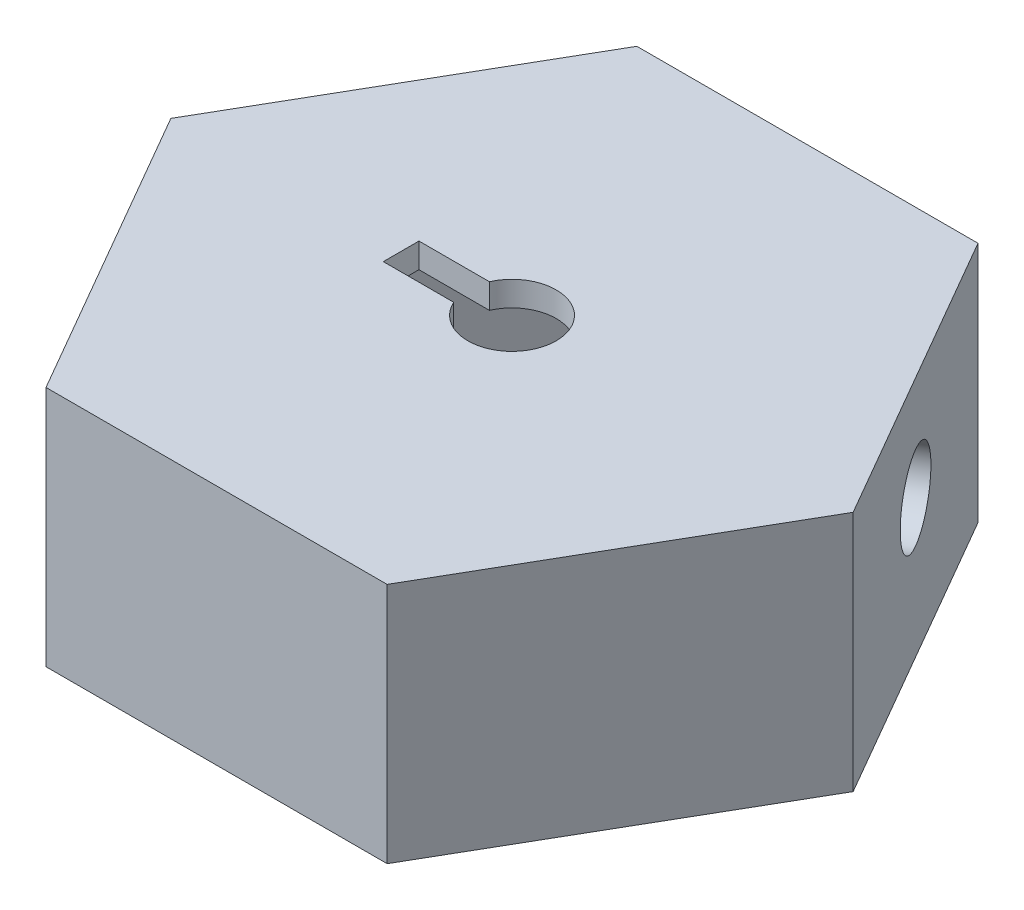
ISO-10303-21;
HEADER;
FILE_DESCRIPTION(('STEP AP214'),'2;1');
FILE_NAME('part.step','',(''),(''),'','','');
FILE_SCHEMA(('AUTOMOTIVE_DESIGN { 1 0 10303 214 1 1 1 1 }'));
ENDSEC;
DATA;
#1=APPLICATION_CONTEXT('core data for automotive mechanical design processes');
#2=APPLICATION_PROTOCOL_DEFINITION('international standard','automotive_design',2000,#1);
#3=PRODUCT_CONTEXT('',#1,'mechanical');
#4=PRODUCT('Part','Part','',(#3));
#5=PRODUCT_RELATED_PRODUCT_CATEGORY('part','',(#4));
#6=PRODUCT_DEFINITION_FORMATION('','',#4);
#7=PRODUCT_DEFINITION_CONTEXT('part definition',#1,'design');
#8=PRODUCT_DEFINITION('design','',#6,#7);
#9=PRODUCT_DEFINITION_SHAPE('','',#8);
#10=(LENGTH_UNIT() NAMED_UNIT(*) SI_UNIT(.MILLI.,.METRE.));
#11=(NAMED_UNIT(*) PLANE_ANGLE_UNIT() SI_UNIT($,.RADIAN.));
#12=(NAMED_UNIT(*) SI_UNIT($,.STERADIAN.) SOLID_ANGLE_UNIT());
#13=UNCERTAINTY_MEASURE_WITH_UNIT(LENGTH_MEASURE(1.E-05),#10,'distance_accuracy_value','');
#14=(GEOMETRIC_REPRESENTATION_CONTEXT(3) GLOBAL_UNCERTAINTY_ASSIGNED_CONTEXT((#13)) GLOBAL_UNIT_ASSIGNED_CONTEXT((#10,
#11,#12)) REPRESENTATION_CONTEXT('',''));
#15=CARTESIAN_POINT('',(0.,0.,0.));
#16=DIRECTION('',(0.,0.,1.));
#17=DIRECTION('',(1.,0.,0.));
#18=AXIS2_PLACEMENT_3D('',#15,#16,#17);
#19=CARTESIAN_POINT('',(0.,2.032,24.1967497817372));
#20=DIRECTION('',(0.,0.,-1.));
#21=DIRECTION('',(-1.,0.,0.));
#22=AXIS2_PLACEMENT_3D('',#19,#20,#21);
#23=PLANE('',#22);
#24=DIRECTION('',(0.,-1.,0.));
#25=VECTOR('',#24,1.);
#26=CARTESIAN_POINT('',(-13.97,2.032,24.1967497817372));
#27=LINE('',#26,#25);
#28=CARTESIAN_POINT('',(-13.97,2.032,24.1967497817372));
#29=VERTEX_POINT('',#28);
#30=CARTESIAN_POINT('',(-13.97,-17.78,24.1967497817372));
#31=VERTEX_POINT('',#30);
#32=EDGE_CURVE('E156',#29,#31,#27,.T.);
#33=ORIENTED_EDGE('',*,*,#32,.T.);
#34=DIRECTION('',(-1.,0.,0.));
#35=VECTOR('',#34,1.);
#36=CARTESIAN_POINT('',(13.97,-17.78,24.1967497817372));
#37=LINE('',#36,#35);
#38=CARTESIAN_POINT('',(13.97,-17.78,24.1967497817372));
#39=VERTEX_POINT('',#38);
#40=EDGE_CURVE('E220',#39,#31,#37,.T.);
#41=ORIENTED_EDGE('',*,*,#40,.F.);
#42=DIRECTION('',(0.,-1.,0.));
#43=VECTOR('',#42,1.);
#44=CARTESIAN_POINT('',(13.97,2.032,24.1967497817372));
#45=LINE('',#44,#43);
#46=CARTESIAN_POINT('',(13.97,2.032,24.1967497817372));
#47=VERTEX_POINT('',#46);
#48=EDGE_CURVE('E11',#47,#39,#45,.T.);
#49=ORIENTED_EDGE('',*,*,#48,.F.);
#50=DIRECTION('',(1.,0.,0.));
#51=VECTOR('',#50,1.);
#52=CARTESIAN_POINT('',(0.,2.032,24.1967497817372));
#53=LINE('',#52,#51);
#54=EDGE_CURVE('E186',#29,#47,#53,.T.);
#55=ORIENTED_EDGE('',*,*,#54,.F.);
#56=EDGE_LOOP('',(#33,#41,#49,#55));
#57=FACE_BOUND('',#56,.T.);
#58=ADVANCED_FACE('F37',(#57),#23,.F.);
#59=CARTESIAN_POINT('',(20.955,2.032,12.0983748908686));
#60=DIRECTION('',(-0.866025403784439,0.,-0.5));
#61=DIRECTION('',(-0.5,0.,0.866025403784439));
#62=AXIS2_PLACEMENT_3D('',#59,#60,#61);
#63=PLANE('',#62);
#64=ORIENTED_EDGE('',*,*,#48,.T.);
#65=DIRECTION('',(-0.5,0.,0.866025403784439));
#66=VECTOR('',#65,1.);
#67=CARTESIAN_POINT('',(27.94,-17.78,0.));
#68=LINE('',#67,#66);
#69=CARTESIAN_POINT('',(27.94,-17.78,0.));
#70=VERTEX_POINT('',#69);
#71=EDGE_CURVE('E202',#70,#39,#68,.T.);
#72=ORIENTED_EDGE('',*,*,#71,.F.);
#73=DIRECTION('',(0.,-1.,0.));
#74=VECTOR('',#73,1.);
#75=CARTESIAN_POINT('',(27.94,2.032,0.));
#76=LINE('',#75,#74);
#77=CARTESIAN_POINT('',(27.94,2.032,0.));
#78=VERTEX_POINT('',#77);
#79=EDGE_CURVE('E46',#78,#70,#76,.T.);
#80=ORIENTED_EDGE('',*,*,#79,.F.);
#81=DIRECTION('',(0.5,0.,-0.866025403784439));
#82=VECTOR('',#81,1.);
#83=CARTESIAN_POINT('',(20.955,2.032,12.0983748908686));
#84=LINE('',#83,#82);
#85=EDGE_CURVE('E193',#47,#78,#84,.T.);
#86=ORIENTED_EDGE('',*,*,#85,.F.);
#87=EDGE_LOOP('',(#64,#72,#80,#86));
#88=FACE_BOUND('',#87,.T.);
#89=ADVANCED_FACE('F199',(#88),#63,.F.);
#90=CARTESIAN_POINT('',(20.955,2.032,-12.0983748908686));
#91=DIRECTION('',(-0.866025403784439,0.,0.5));
#92=DIRECTION('',(0.5,0.,0.866025403784439));
#93=AXIS2_PLACEMENT_3D('',#90,#91,#92);
#94=PLANE('',#93);
#95=CARTESIAN_POINT('',(20.955,-6.477,-12.0983748908686));
#96=DIRECTION('',(0.866025403784439,0.,-0.5));
#97=DIRECTION('',(-0.5,0.,-0.866025403784439));
#98=AXIS2_PLACEMENT_3D('',#95,#96,#97);
#99=CIRCLE('',#98,3.429);
#100=CARTESIAN_POINT('',(19.2405,-6.477,-15.0679760004454));
#101=VERTEX_POINT('',#100);
#102=EDGE_CURVE('E260',#101,#101,#99,.T.);
#103=ORIENTED_EDGE('',*,*,#102,.F.);
#104=EDGE_LOOP('',(#103));
#105=FACE_BOUND('',#104,.T.);
#106=ORIENTED_EDGE('',*,*,#79,.T.);
#107=DIRECTION('',(0.5,0.,0.866025403784439));
#108=VECTOR('',#107,1.);
#109=CARTESIAN_POINT('',(13.97,-17.78,-24.1967497817372));
#110=LINE('',#109,#108);
#111=CARTESIAN_POINT('',(13.97,-17.78,-24.1967497817372));
#112=VERTEX_POINT('',#111);
#113=EDGE_CURVE('E147',#112,#70,#110,.T.);
#114=ORIENTED_EDGE('',*,*,#113,.F.);
#115=DIRECTION('',(0.,-1.,0.));
#116=VECTOR('',#115,1.);
#117=CARTESIAN_POINT('',(13.97,2.032,-24.1967497817372));
#118=LINE('',#117,#116);
#119=CARTESIAN_POINT('',(13.97,2.032,-24.1967497817372));
#120=VERTEX_POINT('',#119);
#121=EDGE_CURVE('E134',#120,#112,#118,.T.);
#122=ORIENTED_EDGE('',*,*,#121,.F.);
#123=DIRECTION('',(-0.5,0.,-0.866025403784439));
#124=VECTOR('',#123,1.);
#125=CARTESIAN_POINT('',(20.955,2.032,-12.0983748908686));
#126=LINE('',#125,#124);
#127=EDGE_CURVE('E119',#78,#120,#126,.T.);
#128=ORIENTED_EDGE('',*,*,#127,.F.);
#129=EDGE_LOOP('',(#106,#114,#122,#128));
#130=FACE_BOUND('',#129,.T.);
#131=ADVANCED_FACE('F206',(#105,#130),#94,.F.);
#132=CARTESIAN_POINT('',(0.,2.032,-24.1967497817372));
#133=DIRECTION('',(0.,0.,1.));
#134=DIRECTION('',(1.,0.,0.));
#135=AXIS2_PLACEMENT_3D('',#132,#133,#134);
#136=PLANE('',#135);
#137=CARTESIAN_POINT('',(0.,-6.477,-24.1967497817372));
#138=DIRECTION('',(0.,0.,-1.));
#139=DIRECTION('',(-1.,0.,0.));
#140=AXIS2_PLACEMENT_3D('',#137,#138,#139);
#141=CIRCLE('',#140,3.429);
#142=CARTESIAN_POINT('',(-3.42900000000005,-6.477,-24.1967497817372));
#143=VERTEX_POINT('',#142);
#144=EDGE_CURVE('E279',#143,#143,#141,.T.);
#145=ORIENTED_EDGE('',*,*,#144,.F.);
#146=EDGE_LOOP('',(#145));
#147=FACE_BOUND('',#146,.T.);
#148=ORIENTED_EDGE('',*,*,#121,.T.);
#149=DIRECTION('',(1.,0.,0.));
#150=VECTOR('',#149,1.);
#151=CARTESIAN_POINT('',(-13.97,-17.78,-24.1967497817372));
#152=LINE('',#151,#150);
#153=CARTESIAN_POINT('',(-13.97,-17.78,-24.1967497817372));
#154=VERTEX_POINT('',#153);
#155=EDGE_CURVE('E130',#154,#112,#152,.T.);
#156=ORIENTED_EDGE('',*,*,#155,.F.);
#157=DIRECTION('',(0.,-1.,0.));
#158=VECTOR('',#157,1.);
#159=CARTESIAN_POINT('',(-13.97,2.032,-24.1967497817372));
#160=LINE('',#159,#158);
#161=CARTESIAN_POINT('',(-13.97,2.032,-24.1967497817372));
#162=VERTEX_POINT('',#161);
#163=EDGE_CURVE('E126',#162,#154,#160,.T.);
#164=ORIENTED_EDGE('',*,*,#163,.F.);
#165=DIRECTION('',(-1.,0.,0.));
#166=VECTOR('',#165,1.);
#167=CARTESIAN_POINT('',(0.,2.032,-24.1967497817372));
#168=LINE('',#167,#166);
#169=EDGE_CURVE('E112',#120,#162,#168,.T.);
#170=ORIENTED_EDGE('',*,*,#169,.F.);
#171=EDGE_LOOP('',(#148,#156,#164,#170));
#172=FACE_BOUND('',#171,.T.);
#173=ADVANCED_FACE('F127',(#147,#172),#136,.F.);
#174=CARTESIAN_POINT('',(-20.955,2.032,-12.0983748908686));
#175=DIRECTION('',(0.866025403784439,0.,0.5));
#176=DIRECTION('',(0.5,0.,-0.866025403784439));
#177=AXIS2_PLACEMENT_3D('',#174,#175,#176);
#178=PLANE('',#177);
#179=CARTESIAN_POINT('',(-20.9550000000001,-6.477,-12.0983748908685));
#180=DIRECTION('',(-0.866025403784441,0.,-0.499999999999996));
#181=DIRECTION('',(-0.499999999999996,0.,0.866025403784441));
#182=AXIS2_PLACEMENT_3D('',#179,#180,#181);
#183=CIRCLE('',#182,3.429);
#184=CARTESIAN_POINT('',(-22.6695,-6.477,-9.12877378129167));
#185=VERTEX_POINT('',#184);
#186=EDGE_CURVE('E285',#185,#185,#183,.T.);
#187=ORIENTED_EDGE('',*,*,#186,.F.);
#188=EDGE_LOOP('',(#187));
#189=FACE_BOUND('',#188,.T.);
#190=ORIENTED_EDGE('',*,*,#163,.T.);
#191=DIRECTION('',(0.5,0.,-0.866025403784439));
#192=VECTOR('',#191,1.);
#193=CARTESIAN_POINT('',(-27.94,-17.78,0.));
#194=LINE('',#193,#192);
#195=CARTESIAN_POINT('',(-27.94,-17.78,0.));
#196=VERTEX_POINT('',#195);
#197=EDGE_CURVE('E213',#196,#154,#194,.T.);
#198=ORIENTED_EDGE('',*,*,#197,.F.);
#199=DIRECTION('',(0.,-1.,0.));
#200=VECTOR('',#199,1.);
#201=CARTESIAN_POINT('',(-27.94,2.032,0.));
#202=LINE('',#201,#200);
#203=CARTESIAN_POINT('',(-27.94,2.032,0.));
#204=VERTEX_POINT('',#203);
#205=EDGE_CURVE('E135',#204,#196,#202,.T.);
#206=ORIENTED_EDGE('',*,*,#205,.F.);
#207=DIRECTION('',(-0.5,0.,0.866025403784439));
#208=VECTOR('',#207,1.);
#209=CARTESIAN_POINT('',(-20.955,2.032,-12.0983748908686));
#210=LINE('',#209,#208);
#211=EDGE_CURVE('E116',#162,#204,#210,.T.);
#212=ORIENTED_EDGE('',*,*,#211,.F.);
#213=EDGE_LOOP('',(#190,#198,#206,#212));
#214=FACE_BOUND('',#213,.T.);
#215=ADVANCED_FACE('F137',(#189,#214),#178,.F.);
#216=CARTESIAN_POINT('',(0.,2.032,0.));
#217=DIRECTION('',(0.,-1.,0.));
#218=DIRECTION('',(0.,0.,-1.));
#219=AXIS2_PLACEMENT_3D('',#216,#217,#218);
#220=CYLINDRICAL_SURFACE('',#219,3.6195);
#221=CARTESIAN_POINT('',(0.,0.,0.));
#222=DIRECTION('',(0.,1.,0.));
#223=DIRECTION('',(0.,0.,1.));
#224=AXIS2_PLACEMENT_3D('',#221,#222,#223);
#225=CIRCLE('',#224,3.6195);
#226=CARTESIAN_POINT('',(-3.31175482184294,0.,1.4605));
#227=VERTEX_POINT('',#226);
#228=CARTESIAN_POINT('',(-3.31175482184294,0.,-1.4605));
#229=VERTEX_POINT('',#228);
#230=EDGE_CURVE('E143',#227,#229,#225,.T.);
#231=ORIENTED_EDGE('',*,*,#230,.F.);
#232=DIRECTION('',(0.,-1.,0.));
#233=VECTOR('',#232,1.);
#234=CARTESIAN_POINT('',(-3.31175482184294,2.032,1.4605));
#235=LINE('',#234,#233);
#236=CARTESIAN_POINT('',(-3.31175482184294,2.032,1.4605));
#237=VERTEX_POINT('',#236);
#238=EDGE_CURVE('E41',#237,#227,#235,.T.);
#239=ORIENTED_EDGE('',*,*,#238,.F.);
#240=CARTESIAN_POINT('',(0.,2.032,0.));
#241=DIRECTION('',(0.,1.,0.));
#242=DIRECTION('',(0.,0.,1.));
#243=AXIS2_PLACEMENT_3D('',#240,#241,#242);
#244=CIRCLE('',#243,3.6195);
#245=CARTESIAN_POINT('',(-3.31175482184294,2.032,-1.4605));
#246=VERTEX_POINT('',#245);
#247=EDGE_CURVE('E155',#237,#246,#244,.T.);
#248=ORIENTED_EDGE('',*,*,#247,.T.);
#249=DIRECTION('',(0.,-1.,0.));
#250=VECTOR('',#249,1.);
#251=CARTESIAN_POINT('',(-3.31175482184294,2.032,-1.4605));
#252=LINE('',#251,#250);
#253=EDGE_CURVE('E85',#246,#229,#252,.T.);
#254=ORIENTED_EDGE('',*,*,#253,.T.);
#255=EDGE_LOOP('',(#231,#239,#248,#254));
#256=FACE_BOUND('',#255,.T.);
#257=ADVANCED_FACE('F39',(#256),#220,.F.);
#258=CARTESIAN_POINT('',(0.,2.032,1.4605));
#259=DIRECTION('',(0.,0.,-1.));
#260=DIRECTION('',(-1.,0.,0.));
#261=AXIS2_PLACEMENT_3D('',#258,#259,#260);
#262=PLANE('',#261);
#263=DIRECTION('',(1.,0.,0.));
#264=VECTOR('',#263,1.);
#265=CARTESIAN_POINT('',(0.,0.,1.4605));
#266=LINE('',#265,#264);
#267=CARTESIAN_POINT('',(-9.0805,0.,1.4605));
#268=VERTEX_POINT('',#267);
#269=EDGE_CURVE('E146',#268,#227,#266,.T.);
#270=ORIENTED_EDGE('',*,*,#269,.F.);
#271=DIRECTION('',(0.,-1.,0.));
#272=VECTOR('',#271,1.);
#273=CARTESIAN_POINT('',(-9.0805,2.032,1.4605));
#274=LINE('',#273,#272);
#275=CARTESIAN_POINT('',(-9.0805,2.032,1.4605));
#276=VERTEX_POINT('',#275);
#277=EDGE_CURVE('E165',#276,#268,#274,.T.);
#278=ORIENTED_EDGE('',*,*,#277,.F.);
#279=DIRECTION('',(1.,0.,0.));
#280=VECTOR('',#279,1.);
#281=CARTESIAN_POINT('',(0.,2.032,1.4605));
#282=LINE('',#281,#280);
#283=EDGE_CURVE('E174',#276,#237,#282,.T.);
#284=ORIENTED_EDGE('',*,*,#283,.T.);
#285=ORIENTED_EDGE('',*,*,#238,.T.);
#286=EDGE_LOOP('',(#270,#278,#284,#285));
#287=FACE_BOUND('',#286,.T.);
#288=ADVANCED_FACE('F172',(#287),#262,.T.);
#289=CARTESIAN_POINT('',(-9.0805,2.032,0.));
#290=DIRECTION('',(1.,0.,0.));
#291=DIRECTION('',(0.,0.,-1.));
#292=AXIS2_PLACEMENT_3D('',#289,#290,#291);
#293=PLANE('',#292);
#294=DIRECTION('',(0.,0.,1.));
#295=VECTOR('',#294,1.);
#296=CARTESIAN_POINT('',(-9.0805,0.,0.));
#297=LINE('',#296,#295);
#298=CARTESIAN_POINT('',(-9.0805,0.,-1.4605));
#299=VERTEX_POINT('',#298);
#300=EDGE_CURVE('E150',#299,#268,#297,.T.);
#301=ORIENTED_EDGE('',*,*,#300,.F.);
#302=DIRECTION('',(0.,-1.,0.));
#303=VECTOR('',#302,1.);
#304=CARTESIAN_POINT('',(-9.0805,2.032,-1.4605));
#305=LINE('',#304,#303);
#306=CARTESIAN_POINT('',(-9.0805,2.032,-1.4605));
#307=VERTEX_POINT('',#306);
#308=EDGE_CURVE('E164',#307,#299,#305,.T.);
#309=ORIENTED_EDGE('',*,*,#308,.F.);
#310=DIRECTION('',(0.,0.,1.));
#311=VECTOR('',#310,1.);
#312=CARTESIAN_POINT('',(-9.0805,2.032,0.));
#313=LINE('',#312,#311);
#314=EDGE_CURVE('E181',#307,#276,#313,.T.);
#315=ORIENTED_EDGE('',*,*,#314,.T.);
#316=ORIENTED_EDGE('',*,*,#277,.T.);
#317=EDGE_LOOP('',(#301,#309,#315,#316));
#318=FACE_BOUND('',#317,.T.);
#319=ADVANCED_FACE('F178',(#318),#293,.T.);
#320=CARTESIAN_POINT('',(0.,2.032,-1.4605));
#321=DIRECTION('',(0.,0.,-1.));
#322=DIRECTION('',(-1.,0.,0.));
#323=AXIS2_PLACEMENT_3D('',#320,#321,#322);
#324=PLANE('',#323);
#325=DIRECTION('',(1.,0.,0.));
#326=VECTOR('',#325,1.);
#327=CARTESIAN_POINT('',(0.,0.,-1.4605));
#328=LINE('',#327,#326);
#329=EDGE_CURVE('E153',#299,#229,#328,.T.);
#330=ORIENTED_EDGE('',*,*,#329,.T.);
#331=ORIENTED_EDGE('',*,*,#253,.F.);
#332=DIRECTION('',(1.,0.,0.));
#333=VECTOR('',#332,1.);
#334=CARTESIAN_POINT('',(0.,2.032,-1.4605));
#335=LINE('',#334,#333);
#336=EDGE_CURVE('E183',#307,#246,#335,.T.);
#337=ORIENTED_EDGE('',*,*,#336,.F.);
#338=ORIENTED_EDGE('',*,*,#308,.T.);
#339=EDGE_LOOP('',(#330,#331,#337,#338));
#340=FACE_BOUND('',#339,.T.);
#341=ADVANCED_FACE('F184',(#340),#324,.F.);
#342=CARTESIAN_POINT('',(-20.955,2.032,12.0983748908686));
#343=DIRECTION('',(0.866025403784439,0.,-0.5));
#344=DIRECTION('',(-0.5,0.,-0.866025403784439));
#345=AXIS2_PLACEMENT_3D('',#342,#343,#344);
#346=PLANE('',#345);
#347=ORIENTED_EDGE('',*,*,#205,.T.);
#348=DIRECTION('',(-0.5,0.,-0.866025403784438));
#349=VECTOR('',#348,1.);
#350=CARTESIAN_POINT('',(-13.97,-17.78,24.1967497817372));
#351=LINE('',#350,#349);
#352=EDGE_CURVE('E216',#31,#196,#351,.T.);
#353=ORIENTED_EDGE('',*,*,#352,.F.);
#354=ORIENTED_EDGE('',*,*,#32,.F.);
#355=DIRECTION('',(0.5,0.,0.866025403784439));
#356=VECTOR('',#355,1.);
#357=CARTESIAN_POINT('',(-20.955,2.032,12.0983748908686));
#358=LINE('',#357,#356);
#359=EDGE_CURVE('E63',#204,#29,#358,.T.);
#360=ORIENTED_EDGE('',*,*,#359,.F.);
#361=EDGE_LOOP('',(#347,#353,#354,#360));
#362=FACE_BOUND('',#361,.T.);
#363=ADVANCED_FACE('F316',(#362),#346,.F.);
#364=CARTESIAN_POINT('',(0.,2.032,0.));
#365=DIRECTION('',(0.,1.,0.));
#366=DIRECTION('',(0.,0.,1.));
#367=AXIS2_PLACEMENT_3D('',#364,#365,#366);
#368=PLANE('',#367);
#369=ORIENTED_EDGE('',*,*,#247,.F.);
#370=ORIENTED_EDGE('',*,*,#283,.F.);
#371=ORIENTED_EDGE('',*,*,#314,.F.);
#372=ORIENTED_EDGE('',*,*,#336,.T.);
#373=EDGE_LOOP('',(#369,#370,#371,#372));
#374=FACE_BOUND('',#373,.T.);
#375=ORIENTED_EDGE('',*,*,#54,.T.);
#376=ORIENTED_EDGE('',*,*,#85,.T.);
#377=ORIENTED_EDGE('',*,*,#127,.T.);
#378=ORIENTED_EDGE('',*,*,#169,.T.);
#379=ORIENTED_EDGE('',*,*,#211,.T.);
#380=ORIENTED_EDGE('',*,*,#359,.T.);
#381=EDGE_LOOP('',(#375,#376,#377,#378,#379,#380));
#382=FACE_BOUND('',#381,.T.);
#383=ADVANCED_FACE('F114',(#374,#382),#368,.T.);
#384=CARTESIAN_POINT('',(0.,0.,0.));
#385=DIRECTION('',(0.,1.,0.));
#386=DIRECTION('',(0.,0.,1.));
#387=AXIS2_PLACEMENT_3D('',#384,#385,#386);
#388=PLANE('',#387);
#389=DIRECTION('',(0.5,0.,0.866025403784439));
#390=VECTOR('',#389,1.);
#391=CARTESIAN_POINT('',(12.7968242530067,0.,-22.1647497817372));
#392=LINE('',#391,#390);
#393=CARTESIAN_POINT('',(12.7968242530067,0.,-22.1647497817372));
#394=VERTEX_POINT('',#393);
#395=CARTESIAN_POINT('',(25.5936485060134,0.,0.));
#396=VERTEX_POINT('',#395);
#397=EDGE_CURVE('E241',#394,#396,#392,.T.);
#398=ORIENTED_EDGE('',*,*,#397,.T.);
#399=DIRECTION('',(-0.5,0.,0.866025403784439));
#400=VECTOR('',#399,1.);
#401=CARTESIAN_POINT('',(25.5936485060134,0.,0.));
#402=LINE('',#401,#400);
#403=CARTESIAN_POINT('',(12.7968242530067,0.,22.1647497817372));
#404=VERTEX_POINT('',#403);
#405=EDGE_CURVE('E257',#396,#404,#402,.T.);
#406=ORIENTED_EDGE('',*,*,#405,.T.);
#407=DIRECTION('',(-1.,0.,0.));
#408=VECTOR('',#407,1.);
#409=CARTESIAN_POINT('',(12.7968242530067,0.,22.1647497817372));
#410=LINE('',#409,#408);
#411=CARTESIAN_POINT('',(-12.7968242530067,0.,22.1647497817372));
#412=VERTEX_POINT('',#411);
#413=EDGE_CURVE('E254',#404,#412,#410,.T.);
#414=ORIENTED_EDGE('',*,*,#413,.T.);
#415=DIRECTION('',(-0.5,0.,-0.866025403784439));
#416=VECTOR('',#415,1.);
#417=CARTESIAN_POINT('',(-12.7968242530067,0.,22.1647497817372));
#418=LINE('',#417,#416);
#419=CARTESIAN_POINT('',(-25.5936485060134,0.,0.));
#420=VERTEX_POINT('',#419);
#421=EDGE_CURVE('E251',#412,#420,#418,.T.);
#422=ORIENTED_EDGE('',*,*,#421,.T.);
#423=DIRECTION('',(0.5,0.,-0.866025403784438));
#424=VECTOR('',#423,1.);
#425=CARTESIAN_POINT('',(-25.5936485060134,0.,0.));
#426=LINE('',#425,#424);
#427=CARTESIAN_POINT('',(-12.7968242530067,0.,-22.1647497817372));
#428=VERTEX_POINT('',#427);
#429=EDGE_CURVE('E248',#420,#428,#426,.T.);
#430=ORIENTED_EDGE('',*,*,#429,.T.);
#431=DIRECTION('',(1.,0.,0.));
#432=VECTOR('',#431,1.);
#433=CARTESIAN_POINT('',(-12.7968242530067,0.,-22.1647497817372));
#434=LINE('',#433,#432);
#435=EDGE_CURVE('E245',#428,#394,#434,.T.);
#436=ORIENTED_EDGE('',*,*,#435,.T.);
#437=EDGE_LOOP('',(#398,#406,#414,#422,#430,#436));
#438=FACE_BOUND('',#437,.T.);
#439=ORIENTED_EDGE('',*,*,#230,.T.);
#440=ORIENTED_EDGE('',*,*,#329,.F.);
#441=ORIENTED_EDGE('',*,*,#300,.T.);
#442=ORIENTED_EDGE('',*,*,#269,.T.);
#443=EDGE_LOOP('',(#439,#440,#441,#442));
#444=FACE_BOUND('',#443,.T.);
#445=ADVANCED_FACE('F177',(#438,#444),#388,.F.);
#446=CARTESIAN_POINT('',(0.,-17.78,0.));
#447=DIRECTION('',(0.,-1.,0.));
#448=DIRECTION('',(0.,0.,-1.));
#449=AXIS2_PLACEMENT_3D('',#446,#447,#448);
#450=PLANE('',#449);
#451=ORIENTED_EDGE('',*,*,#71,.T.);
#452=ORIENTED_EDGE('',*,*,#40,.T.);
#453=ORIENTED_EDGE('',*,*,#352,.T.);
#454=ORIENTED_EDGE('',*,*,#197,.T.);
#455=ORIENTED_EDGE('',*,*,#155,.T.);
#456=ORIENTED_EDGE('',*,*,#113,.T.);
#457=EDGE_LOOP('',(#451,#452,#453,#454,#455,#456));
#458=FACE_BOUND('',#457,.T.);
#459=DIRECTION('',(-1.,0.,0.));
#460=VECTOR('',#459,1.);
#461=CARTESIAN_POINT('',(12.7968242530067,-17.78,22.1647497817372));
#462=LINE('',#461,#460);
#463=CARTESIAN_POINT('',(12.7968242530067,-17.78,22.1647497817372));
#464=VERTEX_POINT('',#463);
#465=CARTESIAN_POINT('',(-12.7968242530067,-17.78,22.1647497817372));
#466=VERTEX_POINT('',#465);
#467=EDGE_CURVE('E271',#464,#466,#462,.T.);
#468=ORIENTED_EDGE('',*,*,#467,.F.);
#469=DIRECTION('',(-0.5,0.,0.866025403784439));
#470=VECTOR('',#469,1.);
#471=CARTESIAN_POINT('',(25.5936485060134,-17.78,0.));
#472=LINE('',#471,#470);
#473=CARTESIAN_POINT('',(25.5936485060134,-17.78,0.));
#474=VERTEX_POINT('',#473);
#475=EDGE_CURVE('E244',#474,#464,#472,.T.);
#476=ORIENTED_EDGE('',*,*,#475,.F.);
#477=DIRECTION('',(0.5,0.,0.866025403784439));
#478=VECTOR('',#477,1.);
#479=CARTESIAN_POINT('',(12.7968242530067,-17.78,-22.1647497817372));
#480=LINE('',#479,#478);
#481=CARTESIAN_POINT('',(12.7968242530067,-17.78,-22.1647497817372));
#482=VERTEX_POINT('',#481);
#483=EDGE_CURVE('E240',#482,#474,#480,.T.);
#484=ORIENTED_EDGE('',*,*,#483,.F.);
#485=DIRECTION('',(1.,0.,0.));
#486=VECTOR('',#485,1.);
#487=CARTESIAN_POINT('',(-12.7968242530067,-17.78,-22.1647497817372));
#488=LINE('',#487,#486);
#489=CARTESIAN_POINT('',(-12.7968242530067,-17.78,-22.1647497817372));
#490=VERTEX_POINT('',#489);
#491=EDGE_CURVE('E262',#490,#482,#488,.T.);
#492=ORIENTED_EDGE('',*,*,#491,.F.);
#493=DIRECTION('',(0.5,0.,-0.866025403784438));
#494=VECTOR('',#493,1.);
#495=CARTESIAN_POINT('',(-25.5936485060134,-17.78,0.));
#496=LINE('',#495,#494);
#497=CARTESIAN_POINT('',(-25.5936485060134,-17.78,0.));
#498=VERTEX_POINT('',#497);
#499=EDGE_CURVE('E265',#498,#490,#496,.T.);
#500=ORIENTED_EDGE('',*,*,#499,.F.);
#501=DIRECTION('',(-0.5,0.,-0.866025403784439));
#502=VECTOR('',#501,1.);
#503=CARTESIAN_POINT('',(-12.7968242530067,-17.78,22.1647497817372));
#504=LINE('',#503,#502);
#505=EDGE_CURVE('E268',#466,#498,#504,.T.);
#506=ORIENTED_EDGE('',*,*,#505,.F.);
#507=EDGE_LOOP('',(#468,#476,#484,#492,#500,#506));
#508=FACE_BOUND('',#507,.T.);
#509=ADVANCED_FACE('F210',(#458,#508),#450,.T.);
#510=CARTESIAN_POINT('',(25.5936485060134,-17.78,0.));
#511=DIRECTION('',(-0.866025403784438,0.,-0.5));
#512=DIRECTION('',(-0.5,0.,0.866025403784439));
#513=AXIS2_PLACEMENT_3D('',#510,#511,#512);
#514=PLANE('',#513);
#515=ORIENTED_EDGE('',*,*,#405,.F.);
#516=DIRECTION('',(0.,1.,0.));
#517=VECTOR('',#516,1.);
#518=CARTESIAN_POINT('',(25.5936485060134,-17.78,0.));
#519=LINE('',#518,#517);
#520=EDGE_CURVE('E54',#474,#396,#519,.T.);
#521=ORIENTED_EDGE('',*,*,#520,.F.);
#522=ORIENTED_EDGE('',*,*,#475,.T.);
#523=DIRECTION('',(0.,1.,0.));
#524=VECTOR('',#523,1.);
#525=CARTESIAN_POINT('',(12.7968242530067,-17.78,22.1647497817372));
#526=LINE('',#525,#524);
#527=EDGE_CURVE('E224',#464,#404,#526,.T.);
#528=ORIENTED_EDGE('',*,*,#527,.T.);
#529=EDGE_LOOP('',(#515,#521,#522,#528));
#530=FACE_BOUND('',#529,.T.);
#531=ADVANCED_FACE('F397',(#530),#514,.T.);
#532=CARTESIAN_POINT('',(12.7968242530067,-17.78,22.1647497817372));
#533=DIRECTION('',(0.,0.,-1.));
#534=DIRECTION('',(-1.,0.,0.));
#535=AXIS2_PLACEMENT_3D('',#532,#533,#534);
#536=PLANE('',#535);
#537=ORIENTED_EDGE('',*,*,#413,.F.);
#538=ORIENTED_EDGE('',*,*,#527,.F.);
#539=ORIENTED_EDGE('',*,*,#467,.T.);
#540=DIRECTION('',(0.,1.,0.));
#541=VECTOR('',#540,1.);
#542=CARTESIAN_POINT('',(-12.7968242530067,-17.78,22.1647497817372));
#543=LINE('',#542,#541);
#544=EDGE_CURVE('E227',#466,#412,#543,.T.);
#545=ORIENTED_EDGE('',*,*,#544,.T.);
#546=EDGE_LOOP('',(#537,#538,#539,#545));
#547=FACE_BOUND('',#546,.T.);
#548=ADVANCED_FACE('F393',(#547),#536,.T.);
#549=CARTESIAN_POINT('',(-12.7968242530067,-17.78,22.1647497817372));
#550=DIRECTION('',(0.866025403784439,0.,-0.5));
#551=DIRECTION('',(-0.5,0.,-0.866025403784439));
#552=AXIS2_PLACEMENT_3D('',#549,#550,#551);
#553=PLANE('',#552);
#554=ORIENTED_EDGE('',*,*,#421,.F.);
#555=ORIENTED_EDGE('',*,*,#544,.F.);
#556=ORIENTED_EDGE('',*,*,#505,.T.);
#557=DIRECTION('',(0.,1.,0.));
#558=VECTOR('',#557,1.);
#559=CARTESIAN_POINT('',(-25.5936485060134,-17.78,0.));
#560=LINE('',#559,#558);
#561=EDGE_CURVE('E230',#498,#420,#560,.T.);
#562=ORIENTED_EDGE('',*,*,#561,.T.);
#563=EDGE_LOOP('',(#554,#555,#556,#562));
#564=FACE_BOUND('',#563,.T.);
#565=ADVANCED_FACE('F344',(#564),#553,.T.);
#566=CARTESIAN_POINT('',(-25.5936485060134,-17.78,0.));
#567=DIRECTION('',(0.866025403784439,0.,0.5));
#568=DIRECTION('',(0.5,0.,-0.866025403784439));
#569=AXIS2_PLACEMENT_3D('',#566,#567,#568);
#570=PLANE('',#569);
#571=CARTESIAN_POINT('',(-19.1952363795101,-6.477,-11.0823748908685));
#572=DIRECTION('',(0.866025403784439,0.,0.5));
#573=DIRECTION('',(0.5,0.,-0.866025403784439));
#574=AXIS2_PLACEMENT_3D('',#571,#572,#573);
#575=CIRCLE('',#574,3.429);
#576=CARTESIAN_POINT('',(-17.4807363795101,-6.477,-14.0519760004454));
#577=VERTEX_POINT('',#576);
#578=EDGE_CURVE('E282',#577,#577,#575,.F.);
#579=ORIENTED_EDGE('',*,*,#578,.T.);
#580=EDGE_LOOP('',(#579));
#581=FACE_BOUND('',#580,.T.);
#582=ORIENTED_EDGE('',*,*,#429,.F.);
#583=ORIENTED_EDGE('',*,*,#561,.F.);
#584=ORIENTED_EDGE('',*,*,#499,.T.);
#585=DIRECTION('',(0.,1.,0.));
#586=VECTOR('',#585,1.);
#587=CARTESIAN_POINT('',(-12.7968242530067,-17.78,-22.1647497817372));
#588=LINE('',#587,#586);
#589=EDGE_CURVE('E233',#490,#428,#588,.T.);
#590=ORIENTED_EDGE('',*,*,#589,.T.);
#591=EDGE_LOOP('',(#582,#583,#584,#590));
#592=FACE_BOUND('',#591,.T.);
#593=ADVANCED_FACE('F338',(#581,#592),#570,.T.);
#594=CARTESIAN_POINT('',(-12.7968242530067,-17.78,-22.1647497817372));
#595=DIRECTION('',(0.,0.,1.));
#596=DIRECTION('',(1.,0.,0.));
#597=AXIS2_PLACEMENT_3D('',#594,#595,#596);
#598=PLANE('',#597);
#599=CARTESIAN_POINT('',(0.,-6.477,-22.1647497817372));
#600=DIRECTION('',(0.,0.,1.));
#601=DIRECTION('',(1.,0.,0.));
#602=AXIS2_PLACEMENT_3D('',#599,#600,#601);
#603=CIRCLE('',#602,3.429);
#604=CARTESIAN_POINT('',(3.42899999999995,-6.477,-22.1647497817372));
#605=VERTEX_POINT('',#604);
#606=EDGE_CURVE('E288',#605,#605,#603,.F.);
#607=ORIENTED_EDGE('',*,*,#606,.T.);
#608=EDGE_LOOP('',(#607));
#609=FACE_BOUND('',#608,.T.);
#610=ORIENTED_EDGE('',*,*,#435,.F.);
#611=ORIENTED_EDGE('',*,*,#589,.F.);
#612=ORIENTED_EDGE('',*,*,#491,.T.);
#613=DIRECTION('',(0.,1.,0.));
#614=VECTOR('',#613,1.);
#615=CARTESIAN_POINT('',(12.7968242530067,-17.78,-22.1647497817372));
#616=LINE('',#615,#614);
#617=EDGE_CURVE('E236',#482,#394,#616,.T.);
#618=ORIENTED_EDGE('',*,*,#617,.T.);
#619=EDGE_LOOP('',(#610,#611,#612,#618));
#620=FACE_BOUND('',#619,.T.);
#621=ADVANCED_FACE('F343',(#609,#620),#598,.T.);
#622=CARTESIAN_POINT('',(12.7968242530067,-17.78,-22.1647497817372));
#623=DIRECTION('',(-0.866025403784439,0.,0.5));
#624=DIRECTION('',(0.5,0.,0.866025403784439));
#625=AXIS2_PLACEMENT_3D('',#622,#623,#624);
#626=PLANE('',#625);
#627=CARTESIAN_POINT('',(19.19523637951,-6.477,-11.0823748908686));
#628=DIRECTION('',(-0.866025403784439,0.,0.5));
#629=DIRECTION('',(0.5,0.,0.866025403784439));
#630=AXIS2_PLACEMENT_3D('',#627,#628,#629);
#631=CIRCLE('',#630,3.429);
#632=CARTESIAN_POINT('',(20.90973637951,-6.477,-8.11277378129178));
#633=VERTEX_POINT('',#632);
#634=EDGE_CURVE('E276',#633,#633,#631,.F.);
#635=ORIENTED_EDGE('',*,*,#634,.T.);
#636=EDGE_LOOP('',(#635));
#637=FACE_BOUND('',#636,.T.);
#638=ORIENTED_EDGE('',*,*,#397,.F.);
#639=ORIENTED_EDGE('',*,*,#617,.F.);
#640=ORIENTED_EDGE('',*,*,#483,.T.);
#641=ORIENTED_EDGE('',*,*,#520,.T.);
#642=EDGE_LOOP('',(#638,#639,#640,#641));
#643=FACE_BOUND('',#642,.T.);
#644=ADVANCED_FACE('F356',(#637,#643),#626,.T.);
#645=CARTESIAN_POINT('',(-31.4336830127019,-6.477,18.1482453490048));
#646=DIRECTION('',(0.866025403784439,0.,-0.5));
#647=DIRECTION('',(-0.5,0.,-0.866025403784439));
#648=AXIS2_PLACEMENT_3D('',#645,#646,#647);
#649=CYLINDRICAL_SURFACE('',#648,3.429);
#650=ORIENTED_EDGE('',*,*,#634,.F.);
#651=EDGE_LOOP('',(#650));
#652=FACE_BOUND('',#651,.T.);
#653=ORIENTED_EDGE('',*,*,#102,.T.);
#654=EDGE_LOOP('',(#653));
#655=FACE_BOUND('',#654,.T.);
#656=ADVANCED_FACE('F369',(#652,#655),#649,.F.);
#657=CARTESIAN_POINT('',(0.,-6.477,24.1977497817373));
#658=DIRECTION('',(0.,0.,-1.));
#659=DIRECTION('',(-1.,0.,0.));
#660=AXIS2_PLACEMENT_3D('',#657,#658,#659);
#661=CYLINDRICAL_SURFACE('',#660,3.429);
#662=ORIENTED_EDGE('',*,*,#606,.F.);
#663=EDGE_LOOP('',(#662));
#664=FACE_BOUND('',#663,.T.);
#665=ORIENTED_EDGE('',*,*,#144,.T.);
#666=EDGE_LOOP('',(#665));
#667=FACE_BOUND('',#666,.T.);
#668=ADVANCED_FACE('F294',(#664,#667),#661,.F.);
#669=CARTESIAN_POINT('',(31.433683012702,-6.477,18.1482453490047));
#670=DIRECTION('',(-0.866025403784441,0.,-0.499999999999996));
#671=DIRECTION('',(-0.499999999999996,0.,0.866025403784441));
#672=AXIS2_PLACEMENT_3D('',#669,#670,#671);
#673=CYLINDRICAL_SURFACE('',#672,3.429);
#674=ORIENTED_EDGE('',*,*,#578,.F.);
#675=EDGE_LOOP('',(#674));
#676=FACE_BOUND('',#675,.T.);
#677=ORIENTED_EDGE('',*,*,#186,.T.);
#678=EDGE_LOOP('',(#677));
#679=FACE_BOUND('',#678,.T.);
#680=ADVANCED_FACE('F368',(#676,#679),#673,.F.);
#681=CLOSED_SHELL('',(#58,#89,#131,#173,#215,#257,#288,#319,#341,#363,#383,#445,#509,#531,#548,
#565,#593,#621,#644,#656,#668,#680));
#682=MANIFOLD_SOLID_BREP('B2',#681);
#683=ADVANCED_BREP_SHAPE_REPRESENTATION('',(#18,#682),#14);
#684=SHAPE_DEFINITION_REPRESENTATION(#9,#683);
ENDSEC;
END-ISO-10303-21;
